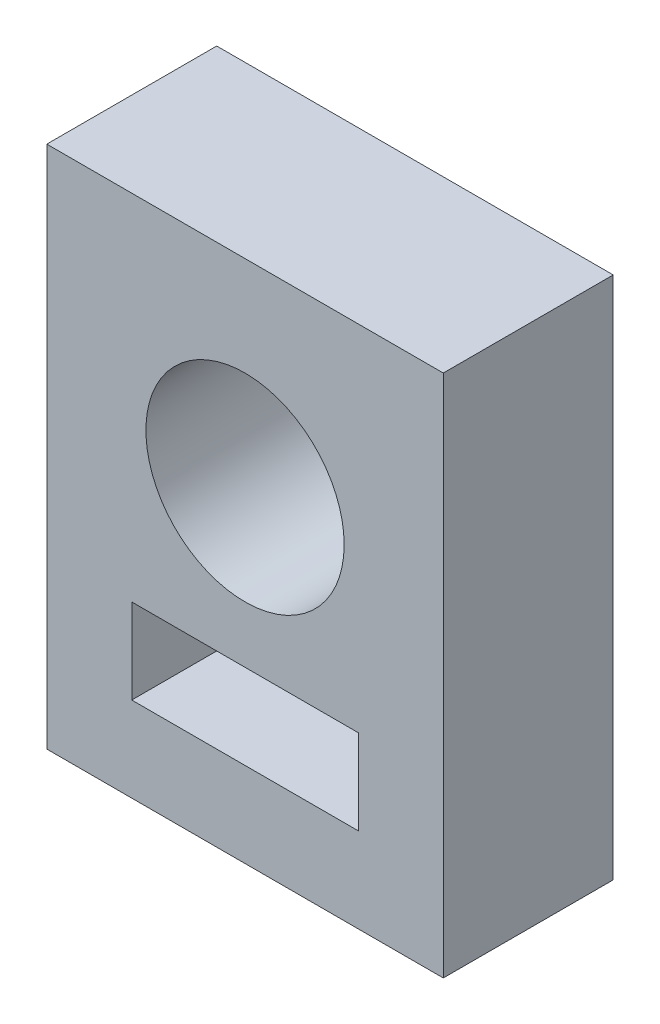
ISO-10303-21;
HEADER;
FILE_DESCRIPTION(('STEP AP214'),'2;1');
FILE_NAME('part.step','',(''),(''),'','','');
FILE_SCHEMA(('AUTOMOTIVE_DESIGN { 1 0 10303 214 1 1 1 1 }'));
ENDSEC;
DATA;
#1=APPLICATION_CONTEXT('core data for automotive mechanical design processes');
#2=APPLICATION_PROTOCOL_DEFINITION('international standard','automotive_design',2000,#1);
#3=PRODUCT_CONTEXT('',#1,'mechanical');
#4=PRODUCT('Part','Part','',(#3));
#5=PRODUCT_RELATED_PRODUCT_CATEGORY('part','',(#4));
#6=PRODUCT_DEFINITION_FORMATION('','',#4);
#7=PRODUCT_DEFINITION_CONTEXT('part definition',#1,'design');
#8=PRODUCT_DEFINITION('design','',#6,#7);
#9=PRODUCT_DEFINITION_SHAPE('','',#8);
#10=(LENGTH_UNIT() NAMED_UNIT(*) SI_UNIT(.MILLI.,.METRE.));
#11=(NAMED_UNIT(*) PLANE_ANGLE_UNIT() SI_UNIT($,.RADIAN.));
#12=(NAMED_UNIT(*) SI_UNIT($,.STERADIAN.) SOLID_ANGLE_UNIT());
#13=UNCERTAINTY_MEASURE_WITH_UNIT(LENGTH_MEASURE(1.E-05),#10,'distance_accuracy_value','');
#14=(GEOMETRIC_REPRESENTATION_CONTEXT(3) GLOBAL_UNCERTAINTY_ASSIGNED_CONTEXT((#13)) GLOBAL_UNIT_ASSIGNED_CONTEXT((#10,
#11,#12)) REPRESENTATION_CONTEXT('',''));
#15=CARTESIAN_POINT('',(0.,0.,0.));
#16=DIRECTION('',(0.,0.,1.));
#17=DIRECTION('',(1.,0.,0.));
#18=AXIS2_PLACEMENT_3D('',#15,#16,#17);
#19=CARTESIAN_POINT('',(0.,0.,6.));
#20=DIRECTION('',(0.,0.,-1.));
#21=DIRECTION('',(-1.,0.,0.));
#22=AXIS2_PLACEMENT_3D('',#19,#20,#21);
#23=PLANE('',#22);
#24=CARTESIAN_POINT('',(0.,2.25,6.));
#25=DIRECTION('',(0.,0.,1.));
#26=DIRECTION('',(1.,0.,0.));
#27=AXIS2_PLACEMENT_3D('',#24,#25,#26);
#28=CIRCLE('',#27,3.5);
#29=CARTESIAN_POINT('',(3.5,2.25,6.));
#30=VERTEX_POINT('',#29);
#31=EDGE_CURVE('E138',#30,#30,#28,.T.);
#32=ORIENTED_EDGE('',*,*,#31,.F.);
#33=EDGE_LOOP('',(#32));
#34=FACE_BOUND('',#33,.T.);
#35=DIRECTION('',(0.,1.,0.));
#36=VECTOR('',#35,1.);
#37=CARTESIAN_POINT('',(7.,-9.25,6.));
#38=LINE('',#37,#36);
#39=CARTESIAN_POINT('',(7.,-9.25,6.));
#40=VERTEX_POINT('',#39);
#41=CARTESIAN_POINT('',(7.,9.25000000000001,6.));
#42=VERTEX_POINT('',#41);
#43=EDGE_CURVE('E144',#40,#42,#38,.T.);
#44=ORIENTED_EDGE('',*,*,#43,.T.);
#45=DIRECTION('',(-1.,0.,0.));
#46=VECTOR('',#45,1.);
#47=CARTESIAN_POINT('',(-7.,9.25000000000001,6.));
#48=LINE('',#47,#46);
#49=CARTESIAN_POINT('',(-7.,9.25000000000001,6.));
#50=VERTEX_POINT('',#49);
#51=EDGE_CURVE('E147',#42,#50,#48,.T.);
#52=ORIENTED_EDGE('',*,*,#51,.T.);
#53=DIRECTION('',(0.,-1.,0.));
#54=VECTOR('',#53,1.);
#55=CARTESIAN_POINT('',(-7.,-9.25,6.));
#56=LINE('',#55,#54);
#57=CARTESIAN_POINT('',(-7.,-9.25,6.));
#58=VERTEX_POINT('',#57);
#59=EDGE_CURVE('E150',#50,#58,#56,.T.);
#60=ORIENTED_EDGE('',*,*,#59,.T.);
#61=DIRECTION('',(1.,0.,0.));
#62=VECTOR('',#61,1.);
#63=CARTESIAN_POINT('',(-7.,-9.25,6.));
#64=LINE('',#63,#62);
#65=EDGE_CURVE('E152',#58,#40,#64,.T.);
#66=ORIENTED_EDGE('',*,*,#65,.T.);
#67=EDGE_LOOP('',(#44,#52,#60,#66));
#68=FACE_BOUND('',#67,.T.);
#69=DIRECTION('',(0.,1.,0.));
#70=VECTOR('',#69,1.);
#71=CARTESIAN_POINT('',(4.,-6.24999999999999,6.));
#72=LINE('',#71,#70);
#73=CARTESIAN_POINT('',(4.,-6.24999999999999,6.));
#74=VERTEX_POINT('',#73);
#75=CARTESIAN_POINT('',(4.,-3.24999999999999,6.));
#76=VERTEX_POINT('',#75);
#77=EDGE_CURVE('E102',#74,#76,#72,.T.);
#78=ORIENTED_EDGE('',*,*,#77,.F.);
#79=DIRECTION('',(1.,0.,0.));
#80=VECTOR('',#79,1.);
#81=CARTESIAN_POINT('',(-4.,-6.25,6.));
#82=LINE('',#81,#80);
#83=CARTESIAN_POINT('',(-4.,-6.25,6.));
#84=VERTEX_POINT('',#83);
#85=EDGE_CURVE('E124',#84,#74,#82,.T.);
#86=ORIENTED_EDGE('',*,*,#85,.F.);
#87=DIRECTION('',(0.,-1.,0.));
#88=VECTOR('',#87,1.);
#89=CARTESIAN_POINT('',(-4.,-6.25,6.));
#90=LINE('',#89,#88);
#91=CARTESIAN_POINT('',(-4.,-3.25,6.));
#92=VERTEX_POINT('',#91);
#93=EDGE_CURVE('E122',#92,#84,#90,.T.);
#94=ORIENTED_EDGE('',*,*,#93,.F.);
#95=DIRECTION('',(-1.,0.,0.));
#96=VECTOR('',#95,1.);
#97=CARTESIAN_POINT('',(-4.,-3.25,6.));
#98=LINE('',#97,#96);
#99=EDGE_CURVE('E110',#76,#92,#98,.T.);
#100=ORIENTED_EDGE('',*,*,#99,.F.);
#101=EDGE_LOOP('',(#78,#86,#94,#100));
#102=FACE_BOUND('',#101,.T.);
#103=ADVANCED_FACE('F37',(#34,#68,#102),#23,.F.);
#104=CARTESIAN_POINT('',(0.,0.,0.));
#105=DIRECTION('',(0.,0.,-1.));
#106=DIRECTION('',(-1.,0.,0.));
#107=AXIS2_PLACEMENT_3D('',#104,#105,#106);
#108=PLANE('',#107);
#109=DIRECTION('',(0.,1.,0.));
#110=VECTOR('',#109,1.);
#111=CARTESIAN_POINT('',(7.,-9.25,0.));
#112=LINE('',#111,#110);
#113=CARTESIAN_POINT('',(7.,-9.25,0.));
#114=VERTEX_POINT('',#113);
#115=CARTESIAN_POINT('',(7.,9.25000000000001,0.));
#116=VERTEX_POINT('',#115);
#117=EDGE_CURVE('E141',#114,#116,#112,.T.);
#118=ORIENTED_EDGE('',*,*,#117,.F.);
#119=DIRECTION('',(1.,0.,0.));
#120=VECTOR('',#119,1.);
#121=CARTESIAN_POINT('',(-7.,-9.25,0.));
#122=LINE('',#121,#120);
#123=CARTESIAN_POINT('',(-7.,-9.25,0.));
#124=VERTEX_POINT('',#123);
#125=EDGE_CURVE('E148',#124,#114,#122,.T.);
#126=ORIENTED_EDGE('',*,*,#125,.F.);
#127=DIRECTION('',(0.,-1.,0.));
#128=VECTOR('',#127,1.);
#129=CARTESIAN_POINT('',(-7.,-9.25,0.));
#130=LINE('',#129,#128);
#131=CARTESIAN_POINT('',(-7.,9.25000000000001,0.));
#132=VERTEX_POINT('',#131);
#133=EDGE_CURVE('E159',#132,#124,#130,.T.);
#134=ORIENTED_EDGE('',*,*,#133,.F.);
#135=DIRECTION('',(-1.,0.,0.));
#136=VECTOR('',#135,1.);
#137=CARTESIAN_POINT('',(-7.,9.25000000000001,0.));
#138=LINE('',#137,#136);
#139=EDGE_CURVE('E157',#116,#132,#138,.T.);
#140=ORIENTED_EDGE('',*,*,#139,.F.);
#141=EDGE_LOOP('',(#118,#126,#134,#140));
#142=FACE_BOUND('',#141,.T.);
#143=CARTESIAN_POINT('',(0.,2.25,0.));
#144=DIRECTION('',(0.,0.,1.));
#145=DIRECTION('',(1.,0.,0.));
#146=AXIS2_PLACEMENT_3D('',#143,#144,#145);
#147=CIRCLE('',#146,3.5);
#148=CARTESIAN_POINT('',(3.5,2.25,0.));
#149=VERTEX_POINT('',#148);
#150=EDGE_CURVE('E118',#149,#149,#147,.T.);
#151=ORIENTED_EDGE('',*,*,#150,.T.);
#152=EDGE_LOOP('',(#151));
#153=FACE_BOUND('',#152,.T.);
#154=DIRECTION('',(1.,0.,0.));
#155=VECTOR('',#154,1.);
#156=CARTESIAN_POINT('',(-4.,-6.25,0.));
#157=LINE('',#156,#155);
#158=CARTESIAN_POINT('',(-4.,-6.25,0.));
#159=VERTEX_POINT('',#158);
#160=CARTESIAN_POINT('',(4.,-6.24999999999999,0.));
#161=VERTEX_POINT('',#160);
#162=EDGE_CURVE('E111',#159,#161,#157,.T.);
#163=ORIENTED_EDGE('',*,*,#162,.T.);
#164=DIRECTION('',(0.,1.,0.));
#165=VECTOR('',#164,1.);
#166=CARTESIAN_POINT('',(4.,-6.24999999999999,0.));
#167=LINE('',#166,#165);
#168=CARTESIAN_POINT('',(4.,-3.24999999999999,0.));
#169=VERTEX_POINT('',#168);
#170=EDGE_CURVE('E60',#161,#169,#167,.T.);
#171=ORIENTED_EDGE('',*,*,#170,.T.);
#172=DIRECTION('',(-1.,0.,0.));
#173=VECTOR('',#172,1.);
#174=CARTESIAN_POINT('',(-4.,-3.25,0.));
#175=LINE('',#174,#173);
#176=CARTESIAN_POINT('',(-4.,-3.25,0.));
#177=VERTEX_POINT('',#176);
#178=EDGE_CURVE('E117',#169,#177,#175,.T.);
#179=ORIENTED_EDGE('',*,*,#178,.T.);
#180=DIRECTION('',(0.,-1.,0.));
#181=VECTOR('',#180,1.);
#182=CARTESIAN_POINT('',(-4.,-6.25,0.));
#183=LINE('',#182,#181);
#184=EDGE_CURVE('E130',#177,#159,#183,.T.);
#185=ORIENTED_EDGE('',*,*,#184,.T.);
#186=EDGE_LOOP('',(#163,#171,#179,#185));
#187=FACE_BOUND('',#186,.T.);
#188=ADVANCED_FACE('F177',(#142,#153,#187),#108,.T.);
#189=CARTESIAN_POINT('',(7.,-9.25,6.));
#190=DIRECTION('',(-1.,0.,0.));
#191=DIRECTION('',(0.,-1.,0.));
#192=AXIS2_PLACEMENT_3D('',#189,#190,#191);
#193=PLANE('',#192);
#194=ORIENTED_EDGE('',*,*,#117,.T.);
#195=DIRECTION('',(0.,0.,-1.));
#196=VECTOR('',#195,1.);
#197=CARTESIAN_POINT('',(7.,9.25000000000001,6.));
#198=LINE('',#197,#196);
#199=EDGE_CURVE('E11',#42,#116,#198,.T.);
#200=ORIENTED_EDGE('',*,*,#199,.F.);
#201=ORIENTED_EDGE('',*,*,#43,.F.);
#202=DIRECTION('',(0.,0.,-1.));
#203=VECTOR('',#202,1.);
#204=CARTESIAN_POINT('',(7.,-9.25,6.));
#205=LINE('',#204,#203);
#206=EDGE_CURVE('E154',#40,#114,#205,.T.);
#207=ORIENTED_EDGE('',*,*,#206,.T.);
#208=EDGE_LOOP('',(#194,#200,#201,#207));
#209=FACE_BOUND('',#208,.T.);
#210=ADVANCED_FACE('F39',(#209),#193,.F.);
#211=CARTESIAN_POINT('',(-7.,9.25000000000001,6.));
#212=DIRECTION('',(0.,-1.,0.));
#213=DIRECTION('',(0.,0.,-1.));
#214=AXIS2_PLACEMENT_3D('',#211,#212,#213);
#215=PLANE('',#214);
#216=ORIENTED_EDGE('',*,*,#139,.T.);
#217=DIRECTION('',(0.,0.,-1.));
#218=VECTOR('',#217,1.);
#219=CARTESIAN_POINT('',(-7.,9.25000000000001,6.));
#220=LINE('',#219,#218);
#221=EDGE_CURVE('E45',#50,#132,#220,.T.);
#222=ORIENTED_EDGE('',*,*,#221,.F.);
#223=ORIENTED_EDGE('',*,*,#51,.F.);
#224=ORIENTED_EDGE('',*,*,#199,.T.);
#225=EDGE_LOOP('',(#216,#222,#223,#224));
#226=FACE_BOUND('',#225,.T.);
#227=ADVANCED_FACE('F187',(#226),#215,.F.);
#228=CARTESIAN_POINT('',(-7.,-9.25,6.));
#229=DIRECTION('',(1.,0.,0.));
#230=DIRECTION('',(0.,1.,0.));
#231=AXIS2_PLACEMENT_3D('',#228,#229,#230);
#232=PLANE('',#231);
#233=ORIENTED_EDGE('',*,*,#133,.T.);
#234=DIRECTION('',(0.,0.,-1.));
#235=VECTOR('',#234,1.);
#236=CARTESIAN_POINT('',(-7.,-9.25,6.));
#237=LINE('',#236,#235);
#238=EDGE_CURVE('E164',#58,#124,#237,.T.);
#239=ORIENTED_EDGE('',*,*,#238,.F.);
#240=ORIENTED_EDGE('',*,*,#59,.F.);
#241=ORIENTED_EDGE('',*,*,#221,.T.);
#242=EDGE_LOOP('',(#233,#239,#240,#241));
#243=FACE_BOUND('',#242,.T.);
#244=ADVANCED_FACE('F171',(#243),#232,.F.);
#245=CARTESIAN_POINT('',(-7.,-9.25,6.));
#246=DIRECTION('',(0.,1.,0.));
#247=DIRECTION('',(0.,0.,1.));
#248=AXIS2_PLACEMENT_3D('',#245,#246,#247);
#249=PLANE('',#248);
#250=ORIENTED_EDGE('',*,*,#125,.T.);
#251=ORIENTED_EDGE('',*,*,#206,.F.);
#252=ORIENTED_EDGE('',*,*,#65,.F.);
#253=ORIENTED_EDGE('',*,*,#238,.T.);
#254=EDGE_LOOP('',(#250,#251,#252,#253));
#255=FACE_BOUND('',#254,.T.);
#256=ADVANCED_FACE('F181',(#255),#249,.F.);
#257=CARTESIAN_POINT('',(0.,2.25,6.));
#258=DIRECTION('',(0.,0.,-1.));
#259=DIRECTION('',(-1.,0.,0.));
#260=AXIS2_PLACEMENT_3D('',#257,#258,#259);
#261=CYLINDRICAL_SURFACE('',#260,3.5);
#262=ORIENTED_EDGE('',*,*,#31,.T.);
#263=EDGE_LOOP('',(#262));
#264=FACE_BOUND('',#263,.T.);
#265=ORIENTED_EDGE('',*,*,#150,.F.);
#266=EDGE_LOOP('',(#265));
#267=FACE_BOUND('',#266,.T.);
#268=ADVANCED_FACE('F203',(#264,#267),#261,.F.);
#269=CARTESIAN_POINT('',(4.,-6.24999999999999,6.));
#270=DIRECTION('',(-1.,0.,0.));
#271=DIRECTION('',(0.,-1.,0.));
#272=AXIS2_PLACEMENT_3D('',#269,#270,#271);
#273=PLANE('',#272);
#274=ORIENTED_EDGE('',*,*,#170,.F.);
#275=DIRECTION('',(0.,0.,-1.));
#276=VECTOR('',#275,1.);
#277=CARTESIAN_POINT('',(4.,-6.24999999999999,6.));
#278=LINE('',#277,#276);
#279=EDGE_CURVE('E106',#74,#161,#278,.T.);
#280=ORIENTED_EDGE('',*,*,#279,.F.);
#281=ORIENTED_EDGE('',*,*,#77,.T.);
#282=DIRECTION('',(0.,0.,-1.));
#283=VECTOR('',#282,1.);
#284=CARTESIAN_POINT('',(4.,-3.24999999999999,6.));
#285=LINE('',#284,#283);
#286=EDGE_CURVE('E105',#76,#169,#285,.T.);
#287=ORIENTED_EDGE('',*,*,#286,.T.);
#288=EDGE_LOOP('',(#274,#280,#281,#287));
#289=FACE_BOUND('',#288,.T.);
#290=ADVANCED_FACE('F104',(#289),#273,.T.);
#291=CARTESIAN_POINT('',(-4.,-3.25,6.));
#292=DIRECTION('',(0.,-1.,0.));
#293=DIRECTION('',(1.,0.,0.));
#294=AXIS2_PLACEMENT_3D('',#291,#292,#293);
#295=PLANE('',#294);
#296=ORIENTED_EDGE('',*,*,#178,.F.);
#297=ORIENTED_EDGE('',*,*,#286,.F.);
#298=ORIENTED_EDGE('',*,*,#99,.T.);
#299=DIRECTION('',(0.,0.,-1.));
#300=VECTOR('',#299,1.);
#301=CARTESIAN_POINT('',(-4.,-3.25,6.));
#302=LINE('',#301,#300);
#303=EDGE_CURVE('E119',#92,#177,#302,.T.);
#304=ORIENTED_EDGE('',*,*,#303,.T.);
#305=EDGE_LOOP('',(#296,#297,#298,#304));
#306=FACE_BOUND('',#305,.T.);
#307=ADVANCED_FACE('F114',(#306),#295,.T.);
#308=CARTESIAN_POINT('',(-4.,-6.25,6.));
#309=DIRECTION('',(1.,0.,0.));
#310=DIRECTION('',(0.,0.,-1.));
#311=AXIS2_PLACEMENT_3D('',#308,#309,#310);
#312=PLANE('',#311);
#313=ORIENTED_EDGE('',*,*,#184,.F.);
#314=ORIENTED_EDGE('',*,*,#303,.F.);
#315=ORIENTED_EDGE('',*,*,#93,.T.);
#316=DIRECTION('',(0.,0.,-1.));
#317=VECTOR('',#316,1.);
#318=CARTESIAN_POINT('',(-4.,-6.25,6.));
#319=LINE('',#318,#317);
#320=EDGE_CURVE('E52',#84,#159,#319,.T.);
#321=ORIENTED_EDGE('',*,*,#320,.T.);
#322=EDGE_LOOP('',(#313,#314,#315,#321));
#323=FACE_BOUND('',#322,.T.);
#324=ADVANCED_FACE('F220',(#323),#312,.T.);
#325=CARTESIAN_POINT('',(-4.,-6.25,6.));
#326=DIRECTION('',(0.,1.,0.));
#327=DIRECTION('',(-1.,0.,0.));
#328=AXIS2_PLACEMENT_3D('',#325,#326,#327);
#329=PLANE('',#328);
#330=ORIENTED_EDGE('',*,*,#162,.F.);
#331=ORIENTED_EDGE('',*,*,#320,.F.);
#332=ORIENTED_EDGE('',*,*,#85,.T.);
#333=ORIENTED_EDGE('',*,*,#279,.T.);
#334=EDGE_LOOP('',(#330,#331,#332,#333));
#335=FACE_BOUND('',#334,.T.);
#336=ADVANCED_FACE('F218',(#335),#329,.T.);
#337=CLOSED_SHELL('',(#103,#188,#210,#227,#244,#256,#268,#290,#307,#324,#336));
#338=MANIFOLD_SOLID_BREP('B2',#337);
#339=ADVANCED_BREP_SHAPE_REPRESENTATION('',(#18,#338),#14);
#340=SHAPE_DEFINITION_REPRESENTATION(#9,#339);
ENDSEC;
END-ISO-10303-21;
